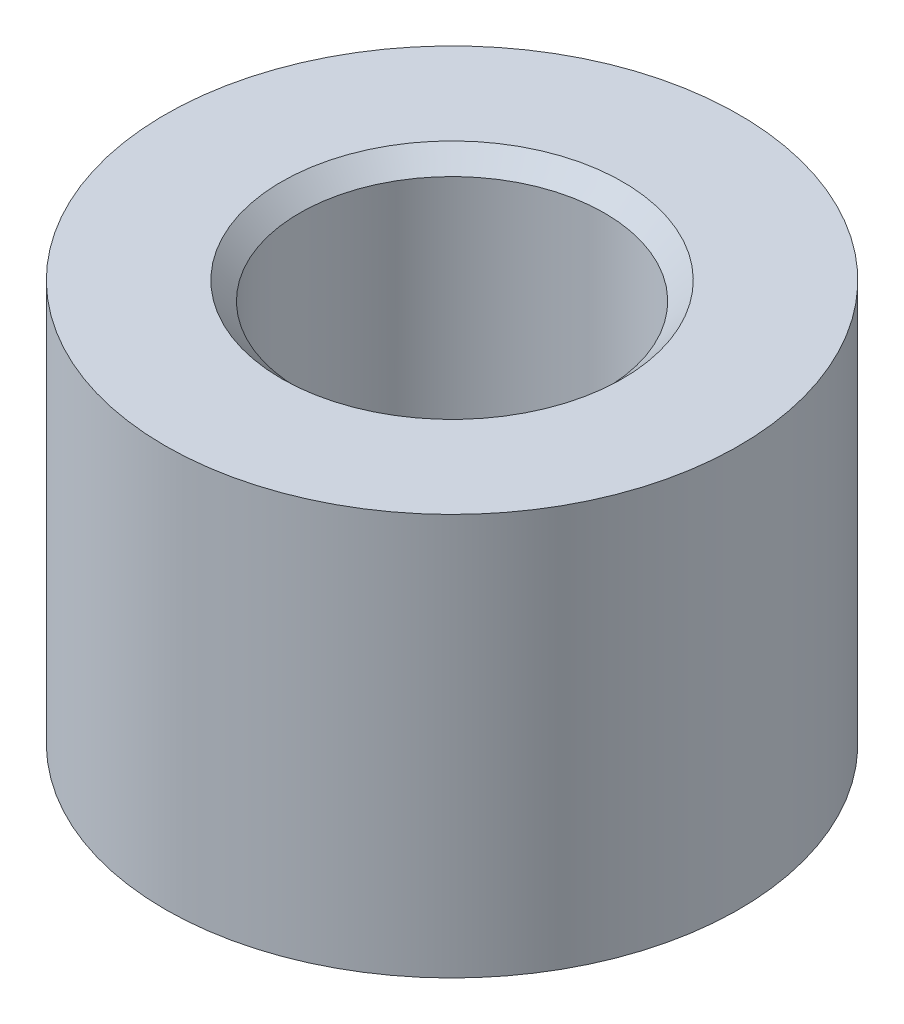
ISO-10303-21;
HEADER;
FILE_DESCRIPTION(('STEP AP214'),'2;1');
FILE_NAME('part.step','',(''),(''),'','','');
FILE_SCHEMA(('AUTOMOTIVE_DESIGN { 1 0 10303 214 1 1 1 1 }'));
ENDSEC;
DATA;
#1=APPLICATION_CONTEXT('core data for automotive mechanical design processes');
#2=APPLICATION_PROTOCOL_DEFINITION('international standard','automotive_design',2000,#1);
#3=PRODUCT_CONTEXT('',#1,'mechanical');
#4=PRODUCT('Part','Part','',(#3));
#5=PRODUCT_RELATED_PRODUCT_CATEGORY('part','',(#4));
#6=PRODUCT_DEFINITION_FORMATION('','',#4);
#7=PRODUCT_DEFINITION_CONTEXT('part definition',#1,'design');
#8=PRODUCT_DEFINITION('design','',#6,#7);
#9=PRODUCT_DEFINITION_SHAPE('','',#8);
#10=(LENGTH_UNIT() NAMED_UNIT(*) SI_UNIT(.MILLI.,.METRE.));
#11=(NAMED_UNIT(*) PLANE_ANGLE_UNIT() SI_UNIT($,.RADIAN.));
#12=(NAMED_UNIT(*) SI_UNIT($,.STERADIAN.) SOLID_ANGLE_UNIT());
#13=UNCERTAINTY_MEASURE_WITH_UNIT(LENGTH_MEASURE(1.E-05),#10,'distance_accuracy_value','');
#14=(GEOMETRIC_REPRESENTATION_CONTEXT(3) GLOBAL_UNCERTAINTY_ASSIGNED_CONTEXT((#13)) GLOBAL_UNIT_ASSIGNED_CONTEXT((#10,
#11,#12)) REPRESENTATION_CONTEXT('',''));
#15=CARTESIAN_POINT('',(0.,0.,0.));
#16=DIRECTION('',(0.,0.,1.));
#17=DIRECTION('',(1.,0.,0.));
#18=AXIS2_PLACEMENT_3D('',#15,#16,#17);
#19=CARTESIAN_POINT('',(0.,8.885072,0.));
#20=DIRECTION('',(0.,1.,0.));
#21=DIRECTION('',(0.,0.,1.));
#22=AXIS2_PLACEMENT_3D('',#19,#20,#21);
#23=PLANE('',#22);
#24=CARTESIAN_POINT('',(0.,8.885072,0.));
#25=DIRECTION('',(0.,1.,0.));
#26=DIRECTION('',(0.,0.,1.));
#27=AXIS2_PLACEMENT_3D('',#24,#25,#26);
#28=CIRCLE('',#27,3.775);
#29=CARTESIAN_POINT('',(0.,8.885072,3.775));
#30=VERTEX_POINT('',#29);
#31=EDGE_CURVE('E10',#30,#30,#28,.F.);
#32=ORIENTED_EDGE('',*,*,#31,.T.);
#33=EDGE_LOOP('',(#32));
#34=FACE_BOUND('',#33,.T.);
#35=CARTESIAN_POINT('',(0.,8.885072,0.));
#36=DIRECTION('',(0.,1.,0.));
#37=DIRECTION('',(0.,0.,1.));
#38=AXIS2_PLACEMENT_3D('',#35,#36,#37);
#39=CIRCLE('',#38,6.35);
#40=CARTESIAN_POINT('',(0.,8.885072,6.35));
#41=VERTEX_POINT('',#40);
#42=EDGE_CURVE('E51',#41,#41,#39,.T.);
#43=ORIENTED_EDGE('',*,*,#42,.T.);
#44=EDGE_LOOP('',(#43));
#45=FACE_BOUND('',#44,.T.);
#46=ADVANCED_FACE('F31',(#34,#45),#23,.T.);
#47=CARTESIAN_POINT('',(0.,0.,0.));
#48=DIRECTION('',(0.,1.,0.));
#49=DIRECTION('',(0.,0.,1.));
#50=AXIS2_PLACEMENT_3D('',#47,#48,#49);
#51=PLANE('',#50);
#52=CARTESIAN_POINT('',(0.,0.,0.));
#53=DIRECTION('',(0.,1.,0.));
#54=DIRECTION('',(0.,0.,1.));
#55=AXIS2_PLACEMENT_3D('',#52,#53,#54);
#56=CIRCLE('',#55,3.775);
#57=CARTESIAN_POINT('',(0.,0.,-3.775));
#58=VERTEX_POINT('',#57);
#59=EDGE_CURVE('E46',#58,#58,#56,.T.);
#60=ORIENTED_EDGE('',*,*,#59,.T.);
#61=EDGE_LOOP('',(#60));
#62=FACE_BOUND('',#61,.T.);
#63=CARTESIAN_POINT('',(0.,0.,0.));
#64=DIRECTION('',(0.,1.,0.));
#65=DIRECTION('',(0.,0.,1.));
#66=AXIS2_PLACEMENT_3D('',#63,#64,#65);
#67=CIRCLE('',#66,6.35);
#68=CARTESIAN_POINT('',(0.,0.,6.35));
#69=VERTEX_POINT('',#68);
#70=EDGE_CURVE('E52',#69,#69,#67,.T.);
#71=ORIENTED_EDGE('',*,*,#70,.F.);
#72=EDGE_LOOP('',(#71));
#73=FACE_BOUND('',#72,.T.);
#74=ADVANCED_FACE('F63',(#62,#73),#51,.F.);
#75=CARTESIAN_POINT('',(0.,8.885072,0.));
#76=DIRECTION('',(0.,-1.,0.));
#77=DIRECTION('',(0.,0.,-1.));
#78=AXIS2_PLACEMENT_3D('',#75,#76,#77);
#79=CYLINDRICAL_SURFACE('',#78,6.35);
#80=ORIENTED_EDGE('',*,*,#42,.F.);
#81=EDGE_LOOP('',(#80));
#82=FACE_BOUND('',#81,.T.);
#83=ORIENTED_EDGE('',*,*,#70,.T.);
#84=EDGE_LOOP('',(#83));
#85=FACE_BOUND('',#84,.T.);
#86=ADVANCED_FACE('F59',(#82,#85),#79,.T.);
#87=CARTESIAN_POINT('',(0.,8.885072,0.));
#88=DIRECTION('',(0.,-1.,0.));
#89=DIRECTION('',(0.,0.,-1.));
#90=AXIS2_PLACEMENT_3D('',#87,#88,#89);
#91=CYLINDRICAL_SURFACE('',#90,3.375);
#92=CARTESIAN_POINT('',(0.,0.399999999999999,0.));
#93=DIRECTION('',(0.,1.,0.));
#94=DIRECTION('',(0.,0.,1.));
#95=AXIS2_PLACEMENT_3D('',#92,#93,#94);
#96=CIRCLE('',#95,3.375);
#97=CARTESIAN_POINT('',(0.,0.399999999999999,-3.375));
#98=VERTEX_POINT('',#97);
#99=EDGE_CURVE('E38',#98,#98,#96,.F.);
#100=ORIENTED_EDGE('',*,*,#99,.T.);
#101=EDGE_LOOP('',(#100));
#102=FACE_BOUND('',#101,.T.);
#103=CARTESIAN_POINT('',(0.,8.485072,0.));
#104=DIRECTION('',(0.,1.,0.));
#105=DIRECTION('',(0.,0.,1.));
#106=AXIS2_PLACEMENT_3D('',#103,#104,#105);
#107=CIRCLE('',#106,3.375);
#108=CARTESIAN_POINT('',(0.,8.485072,3.375));
#109=VERTEX_POINT('',#108);
#110=EDGE_CURVE('E42',#109,#109,#107,.T.);
#111=ORIENTED_EDGE('',*,*,#110,.T.);
#112=EDGE_LOOP('',(#111));
#113=FACE_BOUND('',#112,.T.);
#114=ADVANCED_FACE('F62',(#102,#113),#91,.F.);
#115=CARTESIAN_POINT('',(0.,0.,0.));
#116=DIRECTION('',(0.,-1.,0.));
#117=DIRECTION('',(0.,0.,-1.));
#118=AXIS2_PLACEMENT_3D('',#115,#116,#117);
#119=CONICAL_SURFACE('',#118,3.775,0.785398163397448);
#120=CARTESIAN_POINT('',(0.,0.399999999999999,-3.375));
#121=CARTESIAN_POINT('',(0.,0.395833333333333,-3.37916666666667));
#122=CARTESIAN_POINT('',(0.,0.391666666666666,-3.38333333333333));
#123=CARTESIAN_POINT('',(0.,0.383333333333333,-3.39166666666667));
#124=CARTESIAN_POINT('',(0.,0.379166666666666,-3.39583333333333));
#125=CARTESIAN_POINT('',(0.,0.370833333333333,-3.40416666666667));
#126=CARTESIAN_POINT('',(0.,0.366666666666666,-3.40833333333333));
#127=CARTESIAN_POINT('',(0.,0.358333333333333,-3.41666666666667));
#128=CARTESIAN_POINT('',(0.,0.354166666666666,-3.42083333333333));
#129=CARTESIAN_POINT('',(0.,0.345833333333333,-3.42916666666667));
#130=CARTESIAN_POINT('',(0.,0.341666666666666,-3.43333333333333));
#131=CARTESIAN_POINT('',(0.,0.333333333333333,-3.44166666666667));
#132=CARTESIAN_POINT('',(0.,0.329166666666666,-3.44583333333333));
#133=CARTESIAN_POINT('',(0.,0.320833333333333,-3.45416666666667));
#134=CARTESIAN_POINT('',(0.,0.316666666666666,-3.45833333333333));
#135=CARTESIAN_POINT('',(0.,0.308333333333333,-3.46666666666667));
#136=CARTESIAN_POINT('',(0.,0.304166666666666,-3.47083333333333));
#137=CARTESIAN_POINT('',(0.,0.295833333333333,-3.47916666666667));
#138=CARTESIAN_POINT('',(0.,0.291666666666666,-3.48333333333333));
#139=CARTESIAN_POINT('',(0.,0.283333333333333,-3.49166666666667));
#140=CARTESIAN_POINT('',(0.,0.279166666666666,-3.49583333333333));
#141=CARTESIAN_POINT('',(0.,0.270833333333333,-3.50416666666667));
#142=CARTESIAN_POINT('',(0.,0.266666666666666,-3.50833333333333));
#143=CARTESIAN_POINT('',(0.,0.258333333333333,-3.51666666666667));
#144=CARTESIAN_POINT('',(0.,0.254166666666666,-3.52083333333333));
#145=CARTESIAN_POINT('',(0.,0.245833333333333,-3.52916666666667));
#146=CARTESIAN_POINT('',(0.,0.241666666666666,-3.53333333333333));
#147=CARTESIAN_POINT('',(0.,0.233333333333333,-3.54166666666667));
#148=CARTESIAN_POINT('',(0.,0.229166666666666,-3.54583333333333));
#149=CARTESIAN_POINT('',(0.,0.220833333333333,-3.55416666666667));
#150=CARTESIAN_POINT('',(0.,0.216666666666666,-3.55833333333333));
#151=CARTESIAN_POINT('',(0.,0.208333333333333,-3.56666666666667));
#152=CARTESIAN_POINT('',(0.,0.204166666666666,-3.57083333333333));
#153=CARTESIAN_POINT('',(0.,0.195833333333333,-3.57916666666667));
#154=CARTESIAN_POINT('',(0.,0.191666666666666,-3.58333333333333));
#155=CARTESIAN_POINT('',(0.,0.183333333333333,-3.59166666666667));
#156=CARTESIAN_POINT('',(0.,0.179166666666666,-3.59583333333333));
#157=CARTESIAN_POINT('',(0.,0.170833333333333,-3.60416666666667));
#158=CARTESIAN_POINT('',(0.,0.166666666666666,-3.60833333333333));
#159=CARTESIAN_POINT('',(0.,0.158333333333333,-3.61666666666667));
#160=CARTESIAN_POINT('',(0.,0.154166666666666,-3.62083333333333));
#161=CARTESIAN_POINT('',(0.,0.145833333333333,-3.62916666666667));
#162=CARTESIAN_POINT('',(0.,0.141666666666666,-3.63333333333333));
#163=CARTESIAN_POINT('',(0.,0.133333333333333,-3.64166666666667));
#164=CARTESIAN_POINT('',(0.,0.129166666666666,-3.64583333333333));
#165=CARTESIAN_POINT('',(0.,0.120833333333333,-3.65416666666667));
#166=CARTESIAN_POINT('',(0.,0.116666666666666,-3.65833333333333));
#167=CARTESIAN_POINT('',(0.,0.108333333333333,-3.66666666666667));
#168=CARTESIAN_POINT('',(0.,0.104166666666666,-3.67083333333333));
#169=CARTESIAN_POINT('',(0.,0.0958333333333332,-3.67916666666667));
#170=CARTESIAN_POINT('',(0.,0.0916666666666665,-3.68333333333333));
#171=CARTESIAN_POINT('',(0.,0.0833333333333332,-3.69166666666667));
#172=CARTESIAN_POINT('',(0.,0.0791666666666665,-3.69583333333333));
#173=CARTESIAN_POINT('',(0.,0.0708333333333332,-3.70416666666667));
#174=CARTESIAN_POINT('',(0.,0.0666666666666666,-3.70833333333333));
#175=CARTESIAN_POINT('',(0.,0.0583333333333333,-3.71666666666667));
#176=CARTESIAN_POINT('',(0.,0.0541666666666666,-3.72083333333333));
#177=CARTESIAN_POINT('',(0.,0.0458333333333332,-3.72916666666667));
#178=CARTESIAN_POINT('',(0.,0.0416666666666666,-3.73333333333333));
#179=CARTESIAN_POINT('',(0.,0.0333333333333333,-3.74166666666667));
#180=CARTESIAN_POINT('',(0.,0.0291666666666666,-3.74583333333333));
#181=CARTESIAN_POINT('',(0.,0.0208333333333333,-3.75416666666667));
#182=CARTESIAN_POINT('',(0.,0.0166666666666666,-3.75833333333333));
#183=CARTESIAN_POINT('',(0.,0.00833333333333332,-3.76666666666667));
#184=CARTESIAN_POINT('',(0.,0.00416666666666666,-3.77083333333333));
#185=CARTESIAN_POINT('',(0.,0.,-3.775));
#186=B_SPLINE_CURVE_WITH_KNOTS('',3,(#120,#121,#122,#123,#124,#125,#126,#127,#128,#129,#130,
#131,#132,#133,#134,#135,#136,#137,#138,#139,#140,#141,#142,#143,#144,#145,#146,#147,#148,#149,
#150,#151,#152,#153,#154,#155,#156,#157,#158,#159,#160,#161,#162,#163,#164,#165,#166,#167,#168,
#169,#170,#171,#172,#173,#174,#175,#176,#177,#178,#179,#180,#181,#182,#183,#184,#185),
.UNSPECIFIED.,.F.,.F.,(4,2,2,2,2,2,2,2,2,2,2,2,2,2,2,2,2,2,2,2,2,2,2,2,2,2,2,2,2,2,2,2,4),(0.,
0.0176776695296636,0.0353553390593272,0.0530330085889909,0.0707106781186545,0.0883883476483181,
0.106066017177982,0.123743686707646,0.141421356237309,0.159099025766973,0.176776695296637,
0.1944543648263,0.212132034355964,0.229809703885627,0.247487373415291,0.265165042944955,
0.282842712474618,0.300520382004282,0.318198051533946,0.335875721063609,0.353553390593273,
0.371231060122937,0.3889087296526,0.406586399182264,0.424264068711927,0.441941738241591,
0.459619407771255,0.477297077300919,0.494974746830582,0.512652416360246,0.530330085889909,
0.548007755419573,0.565685424949237),.UNSPECIFIED.);
#187=EDGE_CURVE('BSEAM75',#98,#58,#186,.T.);
#188=ORIENTED_EDGE('',*,*,#99,.F.);
#189=ORIENTED_EDGE('',*,*,#59,.F.);
#190=ORIENTED_EDGE('',*,*,#187,.T.);
#191=ORIENTED_EDGE('',*,*,#187,.F.);
#192=EDGE_LOOP('',(#188,#190,#189,#191));
#193=FACE_BOUND('',#192,.T.);
#194=ADVANCED_FACE('F75',(#193),#119,.F.);
#195=CARTESIAN_POINT('',(0.,8.485072,0.));
#196=DIRECTION('',(0.,1.,0.));
#197=DIRECTION('',(0.,0.,1.));
#198=AXIS2_PLACEMENT_3D('',#195,#196,#197);
#199=CONICAL_SURFACE('',#198,3.375,0.785398163397453);
#200=ORIENTED_EDGE('',*,*,#31,.F.);
#201=EDGE_LOOP('',(#200));
#202=FACE_BOUND('',#201,.T.);
#203=ORIENTED_EDGE('',*,*,#110,.F.);
#204=EDGE_LOOP('',(#203));
#205=FACE_BOUND('',#204,.T.);
#206=ADVANCED_FACE('F33',(#202,#205),#199,.F.);
#207=CLOSED_SHELL('',(#46,#74,#86,#114,#194,#206));
#208=MANIFOLD_SOLID_BREP('B2',#207);
#209=ADVANCED_BREP_SHAPE_REPRESENTATION('',(#18,#208),#14);
#210=SHAPE_DEFINITION_REPRESENTATION(#9,#209);
ENDSEC;
END-ISO-10303-21;
